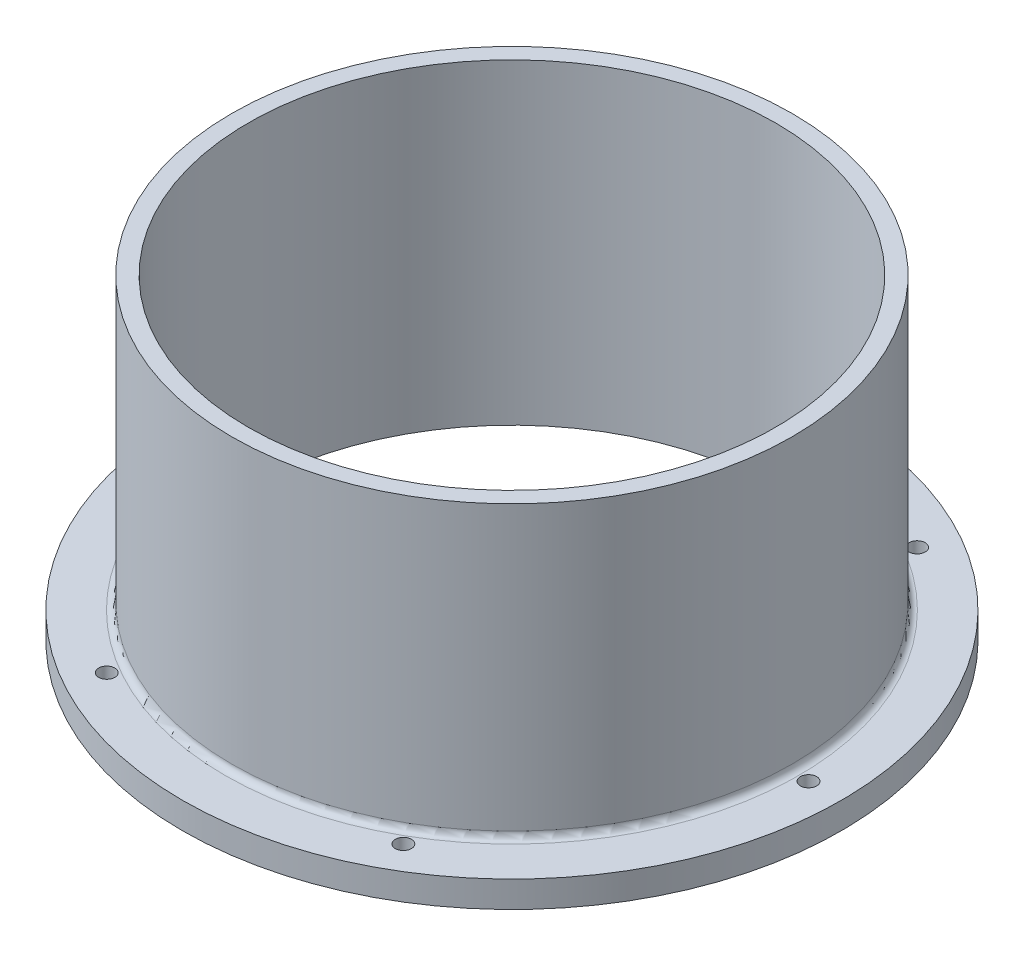
ISO-10303-21;
HEADER;
FILE_DESCRIPTION(('STEP AP214'),'2;1');
FILE_NAME('part.step','',(''),(''),'','','');
FILE_SCHEMA(('AUTOMOTIVE_DESIGN { 1 0 10303 214 1 1 1 1 }'));
ENDSEC;
DATA;
#1=APPLICATION_CONTEXT('core data for automotive mechanical design processes');
#2=APPLICATION_PROTOCOL_DEFINITION('international standard','automotive_design',2000,#1);
#3=PRODUCT_CONTEXT('',#1,'mechanical');
#4=PRODUCT('Part','Part','',(#3));
#5=PRODUCT_RELATED_PRODUCT_CATEGORY('part','',(#4));
#6=PRODUCT_DEFINITION_FORMATION('','',#4);
#7=PRODUCT_DEFINITION_CONTEXT('part definition',#1,'design');
#8=PRODUCT_DEFINITION('design','',#6,#7);
#9=PRODUCT_DEFINITION_SHAPE('','',#8);
#10=(LENGTH_UNIT() NAMED_UNIT(*) SI_UNIT(.MILLI.,.METRE.));
#11=(NAMED_UNIT(*) PLANE_ANGLE_UNIT() SI_UNIT($,.RADIAN.));
#12=(NAMED_UNIT(*) SI_UNIT($,.STERADIAN.) SOLID_ANGLE_UNIT());
#13=UNCERTAINTY_MEASURE_WITH_UNIT(LENGTH_MEASURE(1.E-05),#10,'distance_accuracy_value','');
#14=(GEOMETRIC_REPRESENTATION_CONTEXT(3) GLOBAL_UNCERTAINTY_ASSIGNED_CONTEXT((#13)) GLOBAL_UNIT_ASSIGNED_CONTEXT((#10,
#11,#12)) REPRESENTATION_CONTEXT('',''));
#15=CARTESIAN_POINT('',(0.,0.,0.));
#16=DIRECTION('',(0.,0.,1.));
#17=DIRECTION('',(1.,0.,0.));
#18=AXIS2_PLACEMENT_3D('',#15,#16,#17);
#19=CARTESIAN_POINT('',(-46.75,3.99999999999998,0.));
#20=DIRECTION('',(0.,1.,0.));
#21=DIRECTION('',(0.,0.,1.));
#22=AXIS2_PLACEMENT_3D('',#19,#20,#21);
#23=PLANE('',#22);
#24=CARTESIAN_POINT('',(0.,3.99999999999998,0.));
#25=DIRECTION('',(0.,1.,0.));
#26=DIRECTION('',(-1.,0.,0.));
#27=AXIS2_PLACEMENT_3D('',#24,#25,#26);
#28=CIRCLE('',#27,43.5);
#29=CARTESIAN_POINT('',(-43.5,3.99999999999998,0.));
#30=VERTEX_POINT('',#29);
#31=EDGE_CURVE('E94',#30,#30,#28,.F.);
#32=ORIENTED_EDGE('',*,*,#31,.T.);
#33=EDGE_LOOP('',(#32));
#34=FACE_BOUND('',#33,.T.);
#35=CARTESIAN_POINT('',(-45.,3.99999999999998,0.));
#36=DIRECTION('',(0.,-1.,0.));
#37=DIRECTION('',(0.,0.,-1.));
#38=AXIS2_PLACEMENT_3D('',#35,#36,#37);
#39=CIRCLE('',#38,1.2295);
#40=CARTESIAN_POINT('',(-45.,3.99999999999998,-1.22950000000001));
#41=VERTEX_POINT('',#40);
#42=EDGE_CURVE('E70',#41,#41,#39,.T.);
#43=ORIENTED_EDGE('',*,*,#42,.T.);
#44=EDGE_LOOP('',(#43));
#45=FACE_BOUND('',#44,.T.);
#46=CARTESIAN_POINT('',(-22.5,3.99999999999998,-38.9711431702997));
#47=DIRECTION('',(0.,-1.,0.));
#48=DIRECTION('',(0.,0.,-1.));
#49=AXIS2_PLACEMENT_3D('',#46,#47,#48);
#50=CIRCLE('',#49,1.2295);
#51=CARTESIAN_POINT('',(-22.5,3.99999999999998,-40.2006431702997));
#52=VERTEX_POINT('',#51);
#53=EDGE_CURVE('E74',#52,#52,#50,.T.);
#54=ORIENTED_EDGE('',*,*,#53,.T.);
#55=EDGE_LOOP('',(#54));
#56=FACE_BOUND('',#55,.T.);
#57=CARTESIAN_POINT('',(22.5,3.99999999999998,-38.9711431702997));
#58=DIRECTION('',(0.,-1.,0.));
#59=DIRECTION('',(0.,0.,-1.));
#60=AXIS2_PLACEMENT_3D('',#57,#58,#59);
#61=CIRCLE('',#60,1.2295);
#62=CARTESIAN_POINT('',(22.5,3.99999999999998,-40.2006431702997));
#63=VERTEX_POINT('',#62);
#64=EDGE_CURVE('E78',#63,#63,#61,.T.);
#65=ORIENTED_EDGE('',*,*,#64,.T.);
#66=EDGE_LOOP('',(#65));
#67=FACE_BOUND('',#66,.T.);
#68=CARTESIAN_POINT('',(45.,3.99999999999998,0.));
#69=DIRECTION('',(0.,-1.,0.));
#70=DIRECTION('',(0.,0.,-1.));
#71=AXIS2_PLACEMENT_3D('',#68,#69,#70);
#72=CIRCLE('',#71,1.2295);
#73=CARTESIAN_POINT('',(45.,3.99999999999998,-1.2295));
#74=VERTEX_POINT('',#73);
#75=EDGE_CURVE('E82',#74,#74,#72,.T.);
#76=ORIENTED_EDGE('',*,*,#75,.T.);
#77=EDGE_LOOP('',(#76));
#78=FACE_BOUND('',#77,.T.);
#79=CARTESIAN_POINT('',(22.5,3.99999999999998,38.9711431702997));
#80=DIRECTION('',(0.,-1.,0.));
#81=DIRECTION('',(0.,0.,-1.));
#82=AXIS2_PLACEMENT_3D('',#79,#80,#81);
#83=CIRCLE('',#82,1.2295);
#84=CARTESIAN_POINT('',(22.5,3.99999999999998,37.7416431702997));
#85=VERTEX_POINT('',#84);
#86=EDGE_CURVE('E86',#85,#85,#83,.T.);
#87=ORIENTED_EDGE('',*,*,#86,.T.);
#88=EDGE_LOOP('',(#87));
#89=FACE_BOUND('',#88,.T.);
#90=CARTESIAN_POINT('',(-22.5,3.99999999999998,38.9711431702998));
#91=DIRECTION('',(0.,-1.,0.));
#92=DIRECTION('',(0.,0.,-1.));
#93=AXIS2_PLACEMENT_3D('',#90,#91,#92);
#94=CIRCLE('',#93,1.2295);
#95=CARTESIAN_POINT('',(-22.5,3.99999999999998,37.7416431702998));
#96=VERTEX_POINT('',#95);
#97=EDGE_CURVE('E88',#96,#96,#94,.T.);
#98=ORIENTED_EDGE('',*,*,#97,.T.);
#99=EDGE_LOOP('',(#98));
#100=FACE_BOUND('',#99,.T.);
#101=CARTESIAN_POINT('',(0.,3.99999999999999,0.));
#102=DIRECTION('',(0.,1.,0.));
#103=DIRECTION('',(0.,0.,1.));
#104=AXIS2_PLACEMENT_3D('',#101,#102,#103);
#105=CIRCLE('',#104,50.);
#106=CARTESIAN_POINT('',(0.,3.99999999999999,50.));
#107=VERTEX_POINT('',#106);
#108=EDGE_CURVE('E19',#107,#107,#105,.F.);
#109=ORIENTED_EDGE('',*,*,#108,.F.);
#110=EDGE_LOOP('',(#109));
#111=FACE_BOUND('',#110,.T.);
#112=ADVANCED_FACE('F15',(#34,#45,#56,#67,#78,#89,#100,#111),#23,.T.);
#113=CARTESIAN_POINT('',(0.,4.99999999999998,0.));
#114=DIRECTION('',(0.,1.,0.));
#115=DIRECTION('',(0.,0.,1.));
#116=AXIS2_PLACEMENT_3D('',#113,#114,#115);
#117=TOROIDAL_SURFACE('',#116,43.5,0.999999999999996);
#118=ORIENTED_EDGE('',*,*,#31,.F.);
#119=EDGE_LOOP('',(#118));
#120=FACE_BOUND('',#119,.T.);
#121=CARTESIAN_POINT('',(0.,4.99999999999998,0.));
#122=DIRECTION('',(0.,1.,0.));
#123=DIRECTION('',(0.,0.,1.));
#124=AXIS2_PLACEMENT_3D('',#121,#122,#123);
#125=CIRCLE('',#124,42.5);
#126=CARTESIAN_POINT('',(0.,4.99999999999998,42.5));
#127=VERTEX_POINT('',#126);
#128=EDGE_CURVE('E69',#127,#127,#125,.T.);
#129=ORIENTED_EDGE('',*,*,#128,.F.);
#130=EDGE_LOOP('',(#129));
#131=FACE_BOUND('',#130,.T.);
#132=ADVANCED_FACE('F117',(#120,#131),#117,.F.);
#133=CARTESIAN_POINT('',(0.,1.99999999999998,0.));
#134=DIRECTION('',(0.,1.,0.));
#135=DIRECTION('',(0.,0.,1.));
#136=AXIS2_PLACEMENT_3D('',#133,#134,#135);
#137=CYLINDRICAL_SURFACE('',#136,50.);
#138=CARTESIAN_POINT('',(0.,0.,0.));
#139=DIRECTION('',(0.,1.,0.));
#140=DIRECTION('',(0.,0.,1.));
#141=AXIS2_PLACEMENT_3D('',#138,#139,#140);
#142=CIRCLE('',#141,50.);
#143=CARTESIAN_POINT('',(0.,0.,50.));
#144=VERTEX_POINT('',#143);
#145=EDGE_CURVE('E65',#144,#144,#142,.F.);
#146=ORIENTED_EDGE('',*,*,#145,.F.);
#147=EDGE_LOOP('',(#146));
#148=FACE_BOUND('',#147,.T.);
#149=ORIENTED_EDGE('',*,*,#108,.T.);
#150=EDGE_LOOP('',(#149));
#151=FACE_BOUND('',#150,.T.);
#152=ADVANCED_FACE('F121',(#148,#151),#137,.T.);
#153=CARTESIAN_POINT('',(-22.5,149.345237620756,38.9711431702998));
#154=DIRECTION('',(0.,-1.,0.));
#155=DIRECTION('',(0.,0.,-1.));
#156=AXIS2_PLACEMENT_3D('',#153,#154,#155);
#157=CYLINDRICAL_SURFACE('',#156,1.2295);
#158=CARTESIAN_POINT('',(-22.5,0.,38.9711431702998));
#159=DIRECTION('',(0.,-1.,0.));
#160=DIRECTION('',(0.,0.,-1.));
#161=AXIS2_PLACEMENT_3D('',#158,#159,#160);
#162=CIRCLE('',#161,1.2295);
#163=CARTESIAN_POINT('',(-22.5,0.,37.7416431702998));
#164=VERTEX_POINT('',#163);
#165=EDGE_CURVE('E61',#164,#164,#162,.F.);
#166=ORIENTED_EDGE('',*,*,#165,.F.);
#167=EDGE_LOOP('',(#166));
#168=FACE_BOUND('',#167,.T.);
#169=ORIENTED_EDGE('',*,*,#97,.F.);
#170=EDGE_LOOP('',(#169));
#171=FACE_BOUND('',#170,.T.);
#172=ADVANCED_FACE('F124',(#168,#171),#157,.F.);
#173=CARTESIAN_POINT('',(22.5,149.345237620756,38.9711431702997));
#174=DIRECTION('',(0.,-1.,0.));
#175=DIRECTION('',(0.,0.,-1.));
#176=AXIS2_PLACEMENT_3D('',#173,#174,#175);
#177=CYLINDRICAL_SURFACE('',#176,1.2295);
#178=CARTESIAN_POINT('',(22.5,0.,38.9711431702997));
#179=DIRECTION('',(0.,-1.,0.));
#180=DIRECTION('',(0.,0.,-1.));
#181=AXIS2_PLACEMENT_3D('',#178,#179,#180);
#182=CIRCLE('',#181,1.2295);
#183=CARTESIAN_POINT('',(22.5,0.,37.7416431702997));
#184=VERTEX_POINT('',#183);
#185=EDGE_CURVE('E58',#184,#184,#182,.F.);
#186=ORIENTED_EDGE('',*,*,#185,.F.);
#187=EDGE_LOOP('',(#186));
#188=FACE_BOUND('',#187,.T.);
#189=ORIENTED_EDGE('',*,*,#86,.F.);
#190=EDGE_LOOP('',(#189));
#191=FACE_BOUND('',#190,.T.);
#192=ADVANCED_FACE('F128',(#188,#191),#177,.F.);
#193=CARTESIAN_POINT('',(45.,149.345237620756,0.));
#194=DIRECTION('',(0.,-1.,0.));
#195=DIRECTION('',(0.,0.,-1.));
#196=AXIS2_PLACEMENT_3D('',#193,#194,#195);
#197=CYLINDRICAL_SURFACE('',#196,1.2295);
#198=CARTESIAN_POINT('',(45.,0.,0.));
#199=DIRECTION('',(0.,-1.,0.));
#200=DIRECTION('',(0.,0.,-1.));
#201=AXIS2_PLACEMENT_3D('',#198,#199,#200);
#202=CIRCLE('',#201,1.2295);
#203=CARTESIAN_POINT('',(45.,0.,-1.2295));
#204=VERTEX_POINT('',#203);
#205=EDGE_CURVE('E54',#204,#204,#202,.F.);
#206=ORIENTED_EDGE('',*,*,#205,.F.);
#207=EDGE_LOOP('',(#206));
#208=FACE_BOUND('',#207,.T.);
#209=ORIENTED_EDGE('',*,*,#75,.F.);
#210=EDGE_LOOP('',(#209));
#211=FACE_BOUND('',#210,.T.);
#212=ADVANCED_FACE('F132',(#208,#211),#197,.F.);
#213=CARTESIAN_POINT('',(22.5,149.345237620756,-38.9711431702997));
#214=DIRECTION('',(0.,-1.,0.));
#215=DIRECTION('',(0.,0.,-1.));
#216=AXIS2_PLACEMENT_3D('',#213,#214,#215);
#217=CYLINDRICAL_SURFACE('',#216,1.2295);
#218=CARTESIAN_POINT('',(22.5,0.,-38.9711431702997));
#219=DIRECTION('',(0.,-1.,0.));
#220=DIRECTION('',(0.,0.,-1.));
#221=AXIS2_PLACEMENT_3D('',#218,#219,#220);
#222=CIRCLE('',#221,1.2295);
#223=CARTESIAN_POINT('',(22.5,0.,-40.2006431702997));
#224=VERTEX_POINT('',#223);
#225=EDGE_CURVE('E50',#224,#224,#222,.F.);
#226=ORIENTED_EDGE('',*,*,#225,.F.);
#227=EDGE_LOOP('',(#226));
#228=FACE_BOUND('',#227,.T.);
#229=ORIENTED_EDGE('',*,*,#64,.F.);
#230=EDGE_LOOP('',(#229));
#231=FACE_BOUND('',#230,.T.);
#232=ADVANCED_FACE('F136',(#228,#231),#217,.F.);
#233=CARTESIAN_POINT('',(-22.5,149.345237620756,-38.9711431702997));
#234=DIRECTION('',(0.,-1.,0.));
#235=DIRECTION('',(0.,0.,-1.));
#236=AXIS2_PLACEMENT_3D('',#233,#234,#235);
#237=CYLINDRICAL_SURFACE('',#236,1.2295);
#238=CARTESIAN_POINT('',(-22.5,0.,-38.9711431702997));
#239=DIRECTION('',(0.,-1.,0.));
#240=DIRECTION('',(0.,0.,-1.));
#241=AXIS2_PLACEMENT_3D('',#238,#239,#240);
#242=CIRCLE('',#241,1.2295);
#243=CARTESIAN_POINT('',(-22.5,0.,-40.2006431702997));
#244=VERTEX_POINT('',#243);
#245=EDGE_CURVE('E46',#244,#244,#242,.F.);
#246=ORIENTED_EDGE('',*,*,#245,.F.);
#247=EDGE_LOOP('',(#246));
#248=FACE_BOUND('',#247,.T.);
#249=ORIENTED_EDGE('',*,*,#53,.F.);
#250=EDGE_LOOP('',(#249));
#251=FACE_BOUND('',#250,.T.);
#252=ADVANCED_FACE('F140',(#248,#251),#237,.F.);
#253=CARTESIAN_POINT('',(-45.,149.345237620756,0.));
#254=DIRECTION('',(0.,-1.,0.));
#255=DIRECTION('',(0.,0.,-1.));
#256=AXIS2_PLACEMENT_3D('',#253,#254,#255);
#257=CYLINDRICAL_SURFACE('',#256,1.2295);
#258=CARTESIAN_POINT('',(-45.,0.,0.));
#259=DIRECTION('',(0.,-1.,0.));
#260=DIRECTION('',(0.,0.,-1.));
#261=AXIS2_PLACEMENT_3D('',#258,#259,#260);
#262=CIRCLE('',#261,1.2295);
#263=CARTESIAN_POINT('',(-45.,0.,-1.22950000000001));
#264=VERTEX_POINT('',#263);
#265=EDGE_CURVE('E42',#264,#264,#262,.F.);
#266=ORIENTED_EDGE('',*,*,#265,.F.);
#267=EDGE_LOOP('',(#266));
#268=FACE_BOUND('',#267,.T.);
#269=ORIENTED_EDGE('',*,*,#42,.F.);
#270=EDGE_LOOP('',(#269));
#271=FACE_BOUND('',#270,.T.);
#272=ADVANCED_FACE('F144',(#268,#271),#257,.F.);
#273=CARTESIAN_POINT('',(0.,26.5,0.));
#274=DIRECTION('',(0.,1.,0.));
#275=DIRECTION('',(0.,0.,1.));
#276=AXIS2_PLACEMENT_3D('',#273,#274,#275);
#277=CYLINDRICAL_SURFACE('',#276,42.5);
#278=ORIENTED_EDGE('',*,*,#128,.T.);
#279=EDGE_LOOP('',(#278));
#280=FACE_BOUND('',#279,.T.);
#281=CARTESIAN_POINT('',(0.,48.,0.));
#282=DIRECTION('',(0.,1.,0.));
#283=DIRECTION('',(0.,0.,1.));
#284=AXIS2_PLACEMENT_3D('',#281,#282,#283);
#285=CIRCLE('',#284,42.5);
#286=CARTESIAN_POINT('',(0.,48.,42.5));
#287=VERTEX_POINT('',#286);
#288=EDGE_CURVE('E33',#287,#287,#285,.T.);
#289=ORIENTED_EDGE('',*,*,#288,.F.);
#290=EDGE_LOOP('',(#289));
#291=FACE_BOUND('',#290,.T.);
#292=ADVANCED_FACE('F148',(#280,#291),#277,.T.);
#293=CARTESIAN_POINT('',(-45.,0.,0.));
#294=DIRECTION('',(0.,-1.,0.));
#295=DIRECTION('',(0.,0.,-1.));
#296=AXIS2_PLACEMENT_3D('',#293,#294,#295);
#297=PLANE('',#296);
#298=CARTESIAN_POINT('',(0.,0.,0.));
#299=DIRECTION('',(0.,1.,0.));
#300=DIRECTION('',(0.,0.,1.));
#301=AXIS2_PLACEMENT_3D('',#298,#299,#300);
#302=CIRCLE('',#301,40.);
#303=CARTESIAN_POINT('',(0.,0.,40.));
#304=VERTEX_POINT('',#303);
#305=EDGE_CURVE('E24',#304,#304,#302,.T.);
#306=ORIENTED_EDGE('',*,*,#305,.T.);
#307=EDGE_LOOP('',(#306));
#308=FACE_BOUND('',#307,.T.);
#309=ORIENTED_EDGE('',*,*,#265,.T.);
#310=EDGE_LOOP('',(#309));
#311=FACE_BOUND('',#310,.T.);
#312=ORIENTED_EDGE('',*,*,#245,.T.);
#313=EDGE_LOOP('',(#312));
#314=FACE_BOUND('',#313,.T.);
#315=ORIENTED_EDGE('',*,*,#225,.T.);
#316=EDGE_LOOP('',(#315));
#317=FACE_BOUND('',#316,.T.);
#318=ORIENTED_EDGE('',*,*,#205,.T.);
#319=EDGE_LOOP('',(#318));
#320=FACE_BOUND('',#319,.T.);
#321=ORIENTED_EDGE('',*,*,#185,.T.);
#322=EDGE_LOOP('',(#321));
#323=FACE_BOUND('',#322,.T.);
#324=ORIENTED_EDGE('',*,*,#165,.T.);
#325=EDGE_LOOP('',(#324));
#326=FACE_BOUND('',#325,.T.);
#327=ORIENTED_EDGE('',*,*,#145,.T.);
#328=EDGE_LOOP('',(#327));
#329=FACE_BOUND('',#328,.T.);
#330=ADVANCED_FACE('F152',(#308,#311,#314,#317,#320,#323,#326,#329),#297,.T.);
#331=CARTESIAN_POINT('',(-41.25,48.,0.));
#332=DIRECTION('',(0.,1.,0.));
#333=DIRECTION('',(0.,0.,1.));
#334=AXIS2_PLACEMENT_3D('',#331,#332,#333);
#335=PLANE('',#334);
#336=CARTESIAN_POINT('',(0.,48.,0.));
#337=DIRECTION('',(0.,1.,0.));
#338=DIRECTION('',(0.,0.,1.));
#339=AXIS2_PLACEMENT_3D('',#336,#337,#338);
#340=CIRCLE('',#339,40.);
#341=CARTESIAN_POINT('',(0.,48.,40.));
#342=VERTEX_POINT('',#341);
#343=EDGE_CURVE('E10',#342,#342,#340,.F.);
#344=ORIENTED_EDGE('',*,*,#343,.T.);
#345=EDGE_LOOP('',(#344));
#346=FACE_BOUND('',#345,.T.);
#347=ORIENTED_EDGE('',*,*,#288,.T.);
#348=EDGE_LOOP('',(#347));
#349=FACE_BOUND('',#348,.T.);
#350=ADVANCED_FACE('F156',(#346,#349),#335,.T.);
#351=CARTESIAN_POINT('',(0.,24.,0.));
#352=DIRECTION('',(0.,1.,0.));
#353=DIRECTION('',(0.,0.,1.));
#354=AXIS2_PLACEMENT_3D('',#351,#352,#353);
#355=CYLINDRICAL_SURFACE('',#354,40.);
#356=ORIENTED_EDGE('',*,*,#343,.F.);
#357=EDGE_LOOP('',(#356));
#358=FACE_BOUND('',#357,.T.);
#359=ORIENTED_EDGE('',*,*,#305,.F.);
#360=EDGE_LOOP('',(#359));
#361=FACE_BOUND('',#360,.T.);
#362=ADVANCED_FACE('F160',(#358,#361),#355,.F.);
#363=CLOSED_SHELL('',(#112,#132,#152,#172,#192,#212,#232,#252,#272,#292,#330,#350,#362));
#364=MANIFOLD_SOLID_BREP('B1',#363);
#365=ADVANCED_BREP_SHAPE_REPRESENTATION('',(#18,#364),#14);
#366=SHAPE_DEFINITION_REPRESENTATION(#9,#365);
ENDSEC;
END-ISO-10303-21;
